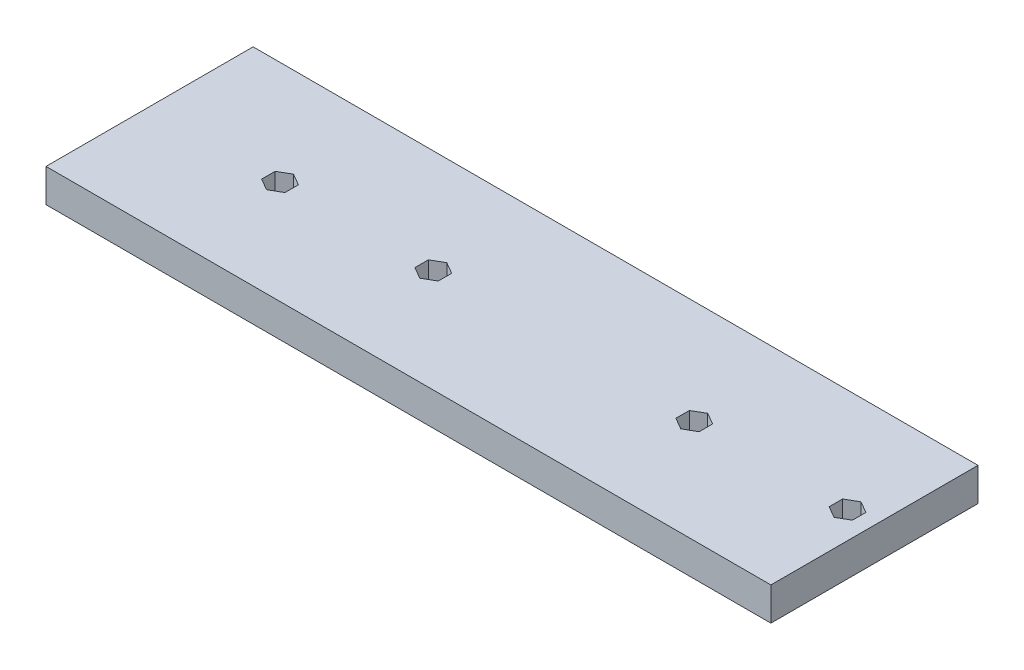
ISO-10303-21;
HEADER;
FILE_DESCRIPTION(('STEP AP214'),'2;1');
FILE_NAME('part.step','',(''),(''),'','','');
FILE_SCHEMA(('AUTOMOTIVE_DESIGN { 1 0 10303 214 1 1 1 1 }'));
ENDSEC;
DATA;
#1=APPLICATION_CONTEXT('core data for automotive mechanical design processes');
#2=APPLICATION_PROTOCOL_DEFINITION('international standard','automotive_design',2000,#1);
#3=PRODUCT_CONTEXT('',#1,'mechanical');
#4=PRODUCT('Part','Part','',(#3));
#5=PRODUCT_RELATED_PRODUCT_CATEGORY('part','',(#4));
#6=PRODUCT_DEFINITION_FORMATION('','',#4);
#7=PRODUCT_DEFINITION_CONTEXT('part definition',#1,'design');
#8=PRODUCT_DEFINITION('design','',#6,#7);
#9=PRODUCT_DEFINITION_SHAPE('','',#8);
#10=(LENGTH_UNIT() NAMED_UNIT(*) SI_UNIT(.MILLI.,.METRE.));
#11=(NAMED_UNIT(*) PLANE_ANGLE_UNIT() SI_UNIT($,.RADIAN.));
#12=(NAMED_UNIT(*) SI_UNIT($,.STERADIAN.) SOLID_ANGLE_UNIT());
#13=UNCERTAINTY_MEASURE_WITH_UNIT(LENGTH_MEASURE(1.E-05),#10,'distance_accuracy_value','');
#14=(GEOMETRIC_REPRESENTATION_CONTEXT(3) GLOBAL_UNCERTAINTY_ASSIGNED_CONTEXT((#13)) GLOBAL_UNIT_ASSIGNED_CONTEXT((#10,
#11,#12)) REPRESENTATION_CONTEXT('',''));
#15=CARTESIAN_POINT('',(0.,0.,0.));
#16=DIRECTION('',(0.,0.,1.));
#17=DIRECTION('',(1.,0.,0.));
#18=AXIS2_PLACEMENT_3D('',#15,#16,#17);
#19=CARTESIAN_POINT('',(975.,-0.00999999999999959,-50.));
#20=DIRECTION('',(-1.,0.,0.));
#21=DIRECTION('',(0.,0.,1.));
#22=AXIS2_PLACEMENT_3D('',#19,#20,#21);
#23=PLANE('',#22);
#24=DIRECTION('',(0.,0.,-1.));
#25=VECTOR('',#24,1.);
#26=CARTESIAN_POINT('',(975.,0.,0.));
#27=LINE('',#26,#25);
#28=CARTESIAN_POINT('',(975.,0.,0.));
#29=VERTEX_POINT('',#28);
#30=CARTESIAN_POINT('',(975.,0.,-50.));
#31=VERTEX_POINT('',#30);
#32=EDGE_CURVE('E213',#29,#31,#27,.T.);
#33=ORIENTED_EDGE('',*,*,#32,.F.);
#34=DIRECTION('',(0.,1.,0.));
#35=VECTOR('',#34,1.);
#36=CARTESIAN_POINT('',(975.,8.,0.));
#37=LINE('',#36,#35);
#38=CARTESIAN_POINT('',(975.,8.,0.));
#39=VERTEX_POINT('',#38);
#40=EDGE_CURVE('E217',#29,#39,#37,.T.);
#41=ORIENTED_EDGE('',*,*,#40,.T.);
#42=DIRECTION('',(0.,0.,-1.));
#43=VECTOR('',#42,1.);
#44=CARTESIAN_POINT('',(975.,8.,0.));
#45=LINE('',#44,#43);
#46=CARTESIAN_POINT('',(975.,8.,-50.));
#47=VERTEX_POINT('',#46);
#48=EDGE_CURVE('E223',#39,#47,#45,.T.);
#49=ORIENTED_EDGE('',*,*,#48,.T.);
#50=DIRECTION('',(0.,-1.,0.));
#51=VECTOR('',#50,1.);
#52=CARTESIAN_POINT('',(975.,8.,-50.));
#53=LINE('',#52,#51);
#54=EDGE_CURVE('E220',#47,#31,#53,.T.);
#55=ORIENTED_EDGE('',*,*,#54,.T.);
#56=EDGE_LOOP('',(#33,#41,#49,#55));
#57=FACE_BOUND('',#56,.T.);
#58=ADVANCED_FACE('F36',(#57),#23,.T.);
#59=CARTESIAN_POINT('',(0.,3.,0.));
#60=DIRECTION('',(0.,1.,0.));
#61=DIRECTION('',(0.,0.,1.));
#62=AXIS2_PLACEMENT_3D('',#59,#60,#61);
#63=PLANE('',#62);
#64=DIRECTION('',(0.866025403784436,0.,0.500000000000005));
#65=VECTOR('',#64,1.);
#66=CARTESIAN_POINT('',(1003.6854174377,3.,-23.375));
#67=LINE('',#66,#65);
#68=CARTESIAN_POINT('',(1003.6854174377,3.,-23.375));
#69=VERTEX_POINT('',#68);
#70=CARTESIAN_POINT('',(1006.5,3.,-21.75));
#71=VERTEX_POINT('',#70);
#72=EDGE_CURVE('E188',#69,#71,#67,.T.);
#73=ORIENTED_EDGE('',*,*,#72,.T.);
#74=DIRECTION('',(0.866025403784435,0.,-0.500000000000007));
#75=VECTOR('',#74,1.);
#76=CARTESIAN_POINT('',(1006.5,3.,-21.75));
#77=LINE('',#76,#75);
#78=CARTESIAN_POINT('',(1009.3145825623,3.,-23.375));
#79=VERTEX_POINT('',#78);
#80=EDGE_CURVE('E197',#71,#79,#77,.T.);
#81=ORIENTED_EDGE('',*,*,#80,.T.);
#82=DIRECTION('',(0.,0.,-1.));
#83=VECTOR('',#82,1.);
#84=CARTESIAN_POINT('',(1009.3145825623,3.,-23.375));
#85=LINE('',#84,#83);
#86=CARTESIAN_POINT('',(1009.3145825623,3.,-26.625));
#87=VERTEX_POINT('',#86);
#88=EDGE_CURVE('E201',#79,#87,#85,.T.);
#89=ORIENTED_EDGE('',*,*,#88,.T.);
#90=DIRECTION('',(-0.866025403784436,0.,-0.500000000000005));
#91=VECTOR('',#90,1.);
#92=CARTESIAN_POINT('',(1009.3145825623,3.,-26.625));
#93=LINE('',#92,#91);
#94=CARTESIAN_POINT('',(1006.5,3.,-28.25));
#95=VERTEX_POINT('',#94);
#96=EDGE_CURVE('E416',#87,#95,#93,.T.);
#97=ORIENTED_EDGE('',*,*,#96,.T.);
#98=DIRECTION('',(-0.866025403784435,0.,0.500000000000007));
#99=VECTOR('',#98,1.);
#100=CARTESIAN_POINT('',(1006.5,3.,-28.25));
#101=LINE('',#100,#99);
#102=CARTESIAN_POINT('',(1003.6854174377,3.,-26.625));
#103=VERTEX_POINT('',#102);
#104=EDGE_CURVE('E414',#95,#103,#101,.T.);
#105=ORIENTED_EDGE('',*,*,#104,.T.);
#106=DIRECTION('',(0.,0.,1.));
#107=VECTOR('',#106,1.);
#108=CARTESIAN_POINT('',(1003.6854174377,3.,-26.625));
#109=LINE('',#108,#107);
#110=EDGE_CURVE('E194',#103,#69,#109,.T.);
#111=ORIENTED_EDGE('',*,*,#110,.T.);
#112=EDGE_LOOP('',(#73,#81,#89,#97,#105,#111));
#113=FACE_BOUND('',#112,.T.);
#114=ADVANCED_FACE('F203',(#113),#63,.T.);
#115=CARTESIAN_POINT('',(0.,3.,0.));
#116=DIRECTION('',(0.,1.,0.));
#117=DIRECTION('',(0.,0.,1.));
#118=AXIS2_PLACEMENT_3D('',#115,#116,#117);
#119=PLANE('',#118);
#120=DIRECTION('',(-0.866025403784433,0.,-0.50000000000001));
#121=VECTOR('',#120,1.);
#122=CARTESIAN_POINT('',(1046.3145825623,3.,-26.625));
#123=LINE('',#122,#121);
#124=CARTESIAN_POINT('',(1046.3145825623,3.,-26.625));
#125=VERTEX_POINT('',#124);
#126=CARTESIAN_POINT('',(1043.5,3.,-28.25));
#127=VERTEX_POINT('',#126);
#128=EDGE_CURVE('E364',#125,#127,#123,.T.);
#129=ORIENTED_EDGE('',*,*,#128,.T.);
#130=DIRECTION('',(-0.866025403784453,0.,0.499999999999976));
#131=VECTOR('',#130,1.);
#132=CARTESIAN_POINT('',(1043.5,3.,-28.25));
#133=LINE('',#132,#131);
#134=CARTESIAN_POINT('',(1040.6854174377,3.,-26.625));
#135=VERTEX_POINT('',#134);
#136=EDGE_CURVE('E389',#127,#135,#133,.T.);
#137=ORIENTED_EDGE('',*,*,#136,.T.);
#138=DIRECTION('',(0.,0.,1.));
#139=VECTOR('',#138,1.);
#140=CARTESIAN_POINT('',(1040.6854174377,3.,-26.625));
#141=LINE('',#140,#139);
#142=CARTESIAN_POINT('',(1040.6854174377,3.,-23.375));
#143=VERTEX_POINT('',#142);
#144=EDGE_CURVE('E386',#135,#143,#141,.T.);
#145=ORIENTED_EDGE('',*,*,#144,.T.);
#146=DIRECTION('',(0.866025403784452,0.,0.499999999999976));
#147=VECTOR('',#146,1.);
#148=CARTESIAN_POINT('',(1040.6854174377,3.,-23.375));
#149=LINE('',#148,#147);
#150=CARTESIAN_POINT('',(1043.5,3.,-21.75));
#151=VERTEX_POINT('',#150);
#152=EDGE_CURVE('E383',#143,#151,#149,.T.);
#153=ORIENTED_EDGE('',*,*,#152,.T.);
#154=DIRECTION('',(0.866025403784437,0.,-0.500000000000003));
#155=VECTOR('',#154,1.);
#156=CARTESIAN_POINT('',(1043.5,3.,-21.75));
#157=LINE('',#156,#155);
#158=CARTESIAN_POINT('',(1046.3145825623,3.,-23.375));
#159=VERTEX_POINT('',#158);
#160=EDGE_CURVE('E380',#151,#159,#157,.T.);
#161=ORIENTED_EDGE('',*,*,#160,.T.);
#162=DIRECTION('',(0.,0.,-1.));
#163=VECTOR('',#162,1.);
#164=CARTESIAN_POINT('',(1046.3145825623,3.,-23.375));
#165=LINE('',#164,#163);
#166=EDGE_CURVE('E349',#159,#125,#165,.T.);
#167=ORIENTED_EDGE('',*,*,#166,.T.);
#168=EDGE_LOOP('',(#129,#137,#145,#153,#161,#167));
#169=FACE_BOUND('',#168,.T.);
#170=ADVANCED_FACE('F490',(#169),#119,.T.);
#171=CARTESIAN_POINT('',(0.,3.,0.));
#172=DIRECTION('',(0.,1.,0.));
#173=DIRECTION('',(0.,0.,1.));
#174=AXIS2_PLACEMENT_3D('',#171,#172,#173);
#175=PLANE('',#174);
#176=DIRECTION('',(0.866025403784436,0.,0.500000000000005));
#177=VECTOR('',#176,1.);
#178=CARTESIAN_POINT('',(1103.6854174377,3.,-23.375));
#179=LINE('',#178,#177);
#180=CARTESIAN_POINT('',(1103.6854174377,3.,-23.375));
#181=VERTEX_POINT('',#180);
#182=CARTESIAN_POINT('',(1106.5,3.,-21.75));
#183=VERTEX_POINT('',#182);
#184=EDGE_CURVE('E316',#181,#183,#179,.T.);
#185=ORIENTED_EDGE('',*,*,#184,.T.);
#186=DIRECTION('',(0.866025403784435,0.,-0.500000000000007));
#187=VECTOR('',#186,1.);
#188=CARTESIAN_POINT('',(1106.5,3.,-21.75));
#189=LINE('',#188,#187);
#190=CARTESIAN_POINT('',(1109.3145825623,3.,-23.375));
#191=VERTEX_POINT('',#190);
#192=EDGE_CURVE('E341',#183,#191,#189,.T.);
#193=ORIENTED_EDGE('',*,*,#192,.T.);
#194=DIRECTION('',(0.,0.,-1.));
#195=VECTOR('',#194,1.);
#196=CARTESIAN_POINT('',(1109.3145825623,3.,-23.375));
#197=LINE('',#196,#195);
#198=CARTESIAN_POINT('',(1109.3145825623,3.,-26.625));
#199=VERTEX_POINT('',#198);
#200=EDGE_CURVE('E338',#191,#199,#197,.T.);
#201=ORIENTED_EDGE('',*,*,#200,.T.);
#202=DIRECTION('',(-0.866025403784436,0.,-0.500000000000005));
#203=VECTOR('',#202,1.);
#204=CARTESIAN_POINT('',(1109.3145825623,3.,-26.625));
#205=LINE('',#204,#203);
#206=CARTESIAN_POINT('',(1106.5,3.,-28.25));
#207=VERTEX_POINT('',#206);
#208=EDGE_CURVE('E335',#199,#207,#205,.T.);
#209=ORIENTED_EDGE('',*,*,#208,.T.);
#210=DIRECTION('',(-0.866025403784435,0.,0.500000000000007));
#211=VECTOR('',#210,1.);
#212=CARTESIAN_POINT('',(1106.5,3.,-28.25));
#213=LINE('',#212,#211);
#214=CARTESIAN_POINT('',(1103.6854174377,3.,-26.625));
#215=VERTEX_POINT('',#214);
#216=EDGE_CURVE('E332',#207,#215,#213,.T.);
#217=ORIENTED_EDGE('',*,*,#216,.T.);
#218=DIRECTION('',(0.,0.,1.));
#219=VECTOR('',#218,1.);
#220=CARTESIAN_POINT('',(1103.6854174377,3.,-26.625));
#221=LINE('',#220,#219);
#222=EDGE_CURVE('E300',#215,#181,#221,.T.);
#223=ORIENTED_EDGE('',*,*,#222,.T.);
#224=EDGE_LOOP('',(#185,#193,#201,#209,#217,#223));
#225=FACE_BOUND('',#224,.T.);
#226=ADVANCED_FACE('F496',(#225),#175,.T.);
#227=CARTESIAN_POINT('',(0.,3.,0.));
#228=DIRECTION('',(0.,1.,0.));
#229=DIRECTION('',(0.,0.,1.));
#230=AXIS2_PLACEMENT_3D('',#227,#228,#229);
#231=PLANE('',#230);
#232=DIRECTION('',(-0.866025403784433,0.,-0.50000000000001));
#233=VECTOR('',#232,1.);
#234=CARTESIAN_POINT('',(1146.3145825623,3.,-26.625));
#235=LINE('',#234,#233);
#236=CARTESIAN_POINT('',(1146.3145825623,3.,-26.625));
#237=VERTEX_POINT('',#236);
#238=CARTESIAN_POINT('',(1143.5,3.,-28.25));
#239=VERTEX_POINT('',#238);
#240=EDGE_CURVE('E272',#237,#239,#235,.T.);
#241=ORIENTED_EDGE('',*,*,#240,.T.);
#242=DIRECTION('',(-0.866025403784453,0.,0.499999999999976));
#243=VECTOR('',#242,1.);
#244=CARTESIAN_POINT('',(1143.5,3.,-28.25));
#245=LINE('',#244,#243);
#246=CARTESIAN_POINT('',(1140.6854174377,3.,-26.625));
#247=VERTEX_POINT('',#246);
#248=EDGE_CURVE('E292',#239,#247,#245,.T.);
#249=ORIENTED_EDGE('',*,*,#248,.T.);
#250=DIRECTION('',(0.,0.,1.));
#251=VECTOR('',#250,1.);
#252=CARTESIAN_POINT('',(1140.6854174377,3.,-26.625));
#253=LINE('',#252,#251);
#254=CARTESIAN_POINT('',(1140.6854174377,3.,-23.375));
#255=VERTEX_POINT('',#254);
#256=EDGE_CURVE('E289',#247,#255,#253,.T.);
#257=ORIENTED_EDGE('',*,*,#256,.T.);
#258=DIRECTION('',(0.866025403784452,0.,0.499999999999976));
#259=VECTOR('',#258,1.);
#260=CARTESIAN_POINT('',(1140.6854174377,3.,-23.375));
#261=LINE('',#260,#259);
#262=CARTESIAN_POINT('',(1143.5,3.,-21.75));
#263=VERTEX_POINT('',#262);
#264=EDGE_CURVE('E286',#255,#263,#261,.T.);
#265=ORIENTED_EDGE('',*,*,#264,.T.);
#266=DIRECTION('',(0.866025403784437,0.,-0.500000000000003));
#267=VECTOR('',#266,1.);
#268=CARTESIAN_POINT('',(1143.5,3.,-21.75));
#269=LINE('',#268,#267);
#270=CARTESIAN_POINT('',(1146.3145825623,3.,-23.375));
#271=VERTEX_POINT('',#270);
#272=EDGE_CURVE('E283',#263,#271,#269,.T.);
#273=ORIENTED_EDGE('',*,*,#272,.T.);
#274=DIRECTION('',(0.,0.,-1.));
#275=VECTOR('',#274,1.);
#276=CARTESIAN_POINT('',(1146.3145825623,3.,-23.375));
#277=LINE('',#276,#275);
#278=EDGE_CURVE('E254',#271,#237,#277,.T.);
#279=ORIENTED_EDGE('',*,*,#278,.T.);
#280=EDGE_LOOP('',(#241,#249,#257,#265,#273,#279));
#281=FACE_BOUND('',#280,.T.);
#282=ADVANCED_FACE('F473',(#281),#231,.T.);
#283=CARTESIAN_POINT('',(1150.,8.,0.));
#284=DIRECTION('',(-1.,0.,0.));
#285=DIRECTION('',(0.,0.,1.));
#286=AXIS2_PLACEMENT_3D('',#283,#284,#285);
#287=PLANE('',#286);
#288=DIRECTION('',(0.,0.,-1.));
#289=VECTOR('',#288,1.);
#290=CARTESIAN_POINT('',(1150.,0.,0.));
#291=LINE('',#290,#289);
#292=CARTESIAN_POINT('',(1150.,0.,0.));
#293=VERTEX_POINT('',#292);
#294=CARTESIAN_POINT('',(1150.,0.,-50.));
#295=VERTEX_POINT('',#294);
#296=EDGE_CURVE('E230',#293,#295,#291,.T.);
#297=ORIENTED_EDGE('',*,*,#296,.T.);
#298=DIRECTION('',(0.,-1.,0.));
#299=VECTOR('',#298,1.);
#300=CARTESIAN_POINT('',(1150.,8.,-50.));
#301=LINE('',#300,#299);
#302=CARTESIAN_POINT('',(1150.,8.,-50.));
#303=VERTEX_POINT('',#302);
#304=EDGE_CURVE('E247',#303,#295,#301,.T.);
#305=ORIENTED_EDGE('',*,*,#304,.F.);
#306=DIRECTION('',(0.,0.,-1.));
#307=VECTOR('',#306,1.);
#308=CARTESIAN_POINT('',(1150.,8.,0.));
#309=LINE('',#308,#307);
#310=CARTESIAN_POINT('',(1150.,8.,0.));
#311=VERTEX_POINT('',#310);
#312=EDGE_CURVE('E235',#311,#303,#309,.T.);
#313=ORIENTED_EDGE('',*,*,#312,.F.);
#314=DIRECTION('',(0.,-1.,0.));
#315=VECTOR('',#314,1.);
#316=CARTESIAN_POINT('',(1150.,8.,0.));
#317=LINE('',#316,#315);
#318=EDGE_CURVE('E216',#311,#293,#317,.T.);
#319=ORIENTED_EDGE('',*,*,#318,.T.);
#320=EDGE_LOOP('',(#297,#305,#313,#319));
#321=FACE_BOUND('',#320,.T.);
#322=ADVANCED_FACE('F511',(#321),#287,.F.);
#323=CARTESIAN_POINT('',(0.,8.,-50.));
#324=DIRECTION('',(0.,0.,1.));
#325=DIRECTION('',(1.,0.,0.));
#326=AXIS2_PLACEMENT_3D('',#323,#324,#325);
#327=PLANE('',#326);
#328=ORIENTED_EDGE('',*,*,#54,.F.);
#329=DIRECTION('',(-1.,0.,0.));
#330=VECTOR('',#329,1.);
#331=CARTESIAN_POINT('',(0.,8.,-50.));
#332=LINE('',#331,#330);
#333=EDGE_CURVE('E40',#303,#47,#332,.T.);
#334=ORIENTED_EDGE('',*,*,#333,.F.);
#335=ORIENTED_EDGE('',*,*,#304,.T.);
#336=DIRECTION('',(-1.,0.,0.));
#337=VECTOR('',#336,1.);
#338=CARTESIAN_POINT('',(0.,0.,-50.));
#339=LINE('',#338,#337);
#340=EDGE_CURVE('E231',#295,#31,#339,.T.);
#341=ORIENTED_EDGE('',*,*,#340,.T.);
#342=EDGE_LOOP('',(#328,#334,#335,#341));
#343=FACE_BOUND('',#342,.T.);
#344=ADVANCED_FACE('F508',(#343),#327,.F.);
#345=CARTESIAN_POINT('',(0.,8.,0.));
#346=DIRECTION('',(0.,0.,-1.));
#347=DIRECTION('',(-1.,0.,0.));
#348=AXIS2_PLACEMENT_3D('',#345,#346,#347);
#349=PLANE('',#348);
#350=ORIENTED_EDGE('',*,*,#40,.F.);
#351=DIRECTION('',(1.,0.,0.));
#352=VECTOR('',#351,1.);
#353=CARTESIAN_POINT('',(0.,0.,0.));
#354=LINE('',#353,#352);
#355=EDGE_CURVE('E226',#29,#293,#354,.T.);
#356=ORIENTED_EDGE('',*,*,#355,.T.);
#357=ORIENTED_EDGE('',*,*,#318,.F.);
#358=DIRECTION('',(1.,0.,0.));
#359=VECTOR('',#358,1.);
#360=CARTESIAN_POINT('',(0.,8.,0.));
#361=LINE('',#360,#359);
#362=EDGE_CURVE('E233',#39,#311,#361,.T.);
#363=ORIENTED_EDGE('',*,*,#362,.F.);
#364=EDGE_LOOP('',(#350,#356,#357,#363));
#365=FACE_BOUND('',#364,.T.);
#366=ADVANCED_FACE('F505',(#365),#349,.F.);
#367=CARTESIAN_POINT('',(0.,0.,0.));
#368=DIRECTION('',(0.,-1.,0.));
#369=DIRECTION('',(0.,0.,-1.));
#370=AXIS2_PLACEMENT_3D('',#367,#368,#369);
#371=PLANE('',#370);
#372=ORIENTED_EDGE('',*,*,#355,.F.);
#373=ORIENTED_EDGE('',*,*,#32,.T.);
#374=ORIENTED_EDGE('',*,*,#340,.F.);
#375=ORIENTED_EDGE('',*,*,#296,.F.);
#376=EDGE_LOOP('',(#372,#373,#374,#375));
#377=FACE_BOUND('',#376,.T.);
#378=ADVANCED_FACE('F38',(#377),#371,.T.);
#379=CARTESIAN_POINT('',(1009.3145825623,3.,-23.375));
#380=DIRECTION('',(1.,0.,0.));
#381=DIRECTION('',(0.,0.,-1.));
#382=AXIS2_PLACEMENT_3D('',#379,#380,#381);
#383=PLANE('',#382);
#384=DIRECTION('',(0.,0.,-1.));
#385=VECTOR('',#384,1.);
#386=CARTESIAN_POINT('',(1009.3145825623,8.,-23.375));
#387=LINE('',#386,#385);
#388=CARTESIAN_POINT('',(1009.3145825623,8.,-23.375));
#389=VERTEX_POINT('',#388);
#390=CARTESIAN_POINT('',(1009.3145825623,8.,-26.625));
#391=VERTEX_POINT('',#390);
#392=EDGE_CURVE('E407',#389,#391,#387,.T.);
#393=ORIENTED_EDGE('',*,*,#392,.T.);
#394=DIRECTION('',(0.,1.,0.));
#395=VECTOR('',#394,1.);
#396=CARTESIAN_POINT('',(1009.3145825623,3.,-26.625));
#397=LINE('',#396,#395);
#398=EDGE_CURVE('E395',#87,#391,#397,.T.);
#399=ORIENTED_EDGE('',*,*,#398,.F.);
#400=ORIENTED_EDGE('',*,*,#88,.F.);
#401=DIRECTION('',(0.,1.,0.));
#402=VECTOR('',#401,1.);
#403=CARTESIAN_POINT('',(1009.3145825623,3.,-23.375));
#404=LINE('',#403,#402);
#405=EDGE_CURVE('E178',#79,#389,#404,.T.);
#406=ORIENTED_EDGE('',*,*,#405,.T.);
#407=EDGE_LOOP('',(#393,#399,#400,#406));
#408=FACE_BOUND('',#407,.T.);
#409=ADVANCED_FACE('F420',(#408),#383,.F.);
#410=CARTESIAN_POINT('',(1009.3145825623,3.,-26.625));
#411=DIRECTION('',(0.500000000000005,0.,-0.866025403784436));
#412=DIRECTION('',(-0.866025403784436,0.,-0.500000000000005));
#413=AXIS2_PLACEMENT_3D('',#410,#411,#412);
#414=PLANE('',#413);
#415=DIRECTION('',(-0.866025403784436,0.,-0.500000000000005));
#416=VECTOR('',#415,1.);
#417=CARTESIAN_POINT('',(1009.3145825623,8.,-26.625));
#418=LINE('',#417,#416);
#419=CARTESIAN_POINT('',(1006.5,8.,-28.25));
#420=VERTEX_POINT('',#419);
#421=EDGE_CURVE('E404',#391,#420,#418,.T.);
#422=ORIENTED_EDGE('',*,*,#421,.T.);
#423=DIRECTION('',(0.,1.,0.));
#424=VECTOR('',#423,1.);
#425=CARTESIAN_POINT('',(1006.5,3.,-28.25));
#426=LINE('',#425,#424);
#427=EDGE_CURVE('E397',#95,#420,#426,.T.);
#428=ORIENTED_EDGE('',*,*,#427,.F.);
#429=ORIENTED_EDGE('',*,*,#96,.F.);
#430=ORIENTED_EDGE('',*,*,#398,.T.);
#431=EDGE_LOOP('',(#422,#428,#429,#430));
#432=FACE_BOUND('',#431,.T.);
#433=ADVANCED_FACE('F424',(#432),#414,.F.);
#434=CARTESIAN_POINT('',(1006.5,3.,-28.25));
#435=DIRECTION('',(-0.500000000000007,0.,-0.866025403784435));
#436=DIRECTION('',(-0.866025403784435,0.,0.500000000000007));
#437=AXIS2_PLACEMENT_3D('',#434,#435,#436);
#438=PLANE('',#437);
#439=DIRECTION('',(-0.866025403784435,0.,0.500000000000007));
#440=VECTOR('',#439,1.);
#441=CARTESIAN_POINT('',(1006.5,8.,-28.25));
#442=LINE('',#441,#440);
#443=CARTESIAN_POINT('',(1003.6854174377,8.,-26.625));
#444=VERTEX_POINT('',#443);
#445=EDGE_CURVE('E209',#420,#444,#442,.T.);
#446=ORIENTED_EDGE('',*,*,#445,.T.);
#447=DIRECTION('',(0.,1.,0.));
#448=VECTOR('',#447,1.);
#449=CARTESIAN_POINT('',(1003.6854174377,3.,-26.625));
#450=LINE('',#449,#448);
#451=EDGE_CURVE('E399',#103,#444,#450,.T.);
#452=ORIENTED_EDGE('',*,*,#451,.F.);
#453=ORIENTED_EDGE('',*,*,#104,.F.);
#454=ORIENTED_EDGE('',*,*,#427,.T.);
#455=EDGE_LOOP('',(#446,#452,#453,#454));
#456=FACE_BOUND('',#455,.T.);
#457=ADVANCED_FACE('F428',(#456),#438,.F.);
#458=CARTESIAN_POINT('',(1003.6854174377,3.,-26.625));
#459=DIRECTION('',(-1.,0.,0.));
#460=DIRECTION('',(0.,0.,1.));
#461=AXIS2_PLACEMENT_3D('',#458,#459,#460);
#462=PLANE('',#461);
#463=DIRECTION('',(0.,0.,1.));
#464=VECTOR('',#463,1.);
#465=CARTESIAN_POINT('',(1003.6854174377,8.,-26.625));
#466=LINE('',#465,#464);
#467=CARTESIAN_POINT('',(1003.6854174377,8.,-23.375));
#468=VERTEX_POINT('',#467);
#469=EDGE_CURVE('E206',#444,#468,#466,.T.);
#470=ORIENTED_EDGE('',*,*,#469,.T.);
#471=DIRECTION('',(0.,1.,0.));
#472=VECTOR('',#471,1.);
#473=CARTESIAN_POINT('',(1003.6854174377,3.,-23.375));
#474=LINE('',#473,#472);
#475=EDGE_CURVE('E229',#69,#468,#474,.T.);
#476=ORIENTED_EDGE('',*,*,#475,.F.);
#477=ORIENTED_EDGE('',*,*,#110,.F.);
#478=ORIENTED_EDGE('',*,*,#451,.T.);
#479=EDGE_LOOP('',(#470,#476,#477,#478));
#480=FACE_BOUND('',#479,.T.);
#481=ADVANCED_FACE('F430',(#480),#462,.F.);
#482=CARTESIAN_POINT('',(1003.6854174377,3.,-23.375));
#483=DIRECTION('',(-0.500000000000005,0.,0.866025403784436));
#484=DIRECTION('',(0.866025403784436,0.,0.500000000000005));
#485=AXIS2_PLACEMENT_3D('',#482,#483,#484);
#486=PLANE('',#485);
#487=DIRECTION('',(0.866025403784436,0.,0.500000000000005));
#488=VECTOR('',#487,1.);
#489=CARTESIAN_POINT('',(1003.6854174377,8.,-23.375));
#490=LINE('',#489,#488);
#491=CARTESIAN_POINT('',(1006.5,8.,-21.75));
#492=VERTEX_POINT('',#491);
#493=EDGE_CURVE('E192',#468,#492,#490,.T.);
#494=ORIENTED_EDGE('',*,*,#493,.T.);
#495=DIRECTION('',(0.,1.,0.));
#496=VECTOR('',#495,1.);
#497=CARTESIAN_POINT('',(1006.5,3.,-21.75));
#498=LINE('',#497,#496);
#499=EDGE_CURVE('E185',#71,#492,#498,.T.);
#500=ORIENTED_EDGE('',*,*,#499,.F.);
#501=ORIENTED_EDGE('',*,*,#72,.F.);
#502=ORIENTED_EDGE('',*,*,#475,.T.);
#503=EDGE_LOOP('',(#494,#500,#501,#502));
#504=FACE_BOUND('',#503,.T.);
#505=ADVANCED_FACE('F186',(#504),#486,.F.);
#506=CARTESIAN_POINT('',(1006.5,3.,-21.75));
#507=DIRECTION('',(0.500000000000007,0.,0.866025403784435));
#508=DIRECTION('',(0.866025403784435,0.,-0.500000000000007));
#509=AXIS2_PLACEMENT_3D('',#506,#507,#508);
#510=PLANE('',#509);
#511=DIRECTION('',(0.866025403784435,0.,-0.500000000000007));
#512=VECTOR('',#511,1.);
#513=CARTESIAN_POINT('',(1006.5,8.,-21.75));
#514=LINE('',#513,#512);
#515=EDGE_CURVE('E410',#492,#389,#514,.T.);
#516=ORIENTED_EDGE('',*,*,#515,.T.);
#517=ORIENTED_EDGE('',*,*,#405,.F.);
#518=ORIENTED_EDGE('',*,*,#80,.F.);
#519=ORIENTED_EDGE('',*,*,#499,.T.);
#520=EDGE_LOOP('',(#516,#517,#518,#519));
#521=FACE_BOUND('',#520,.T.);
#522=ADVANCED_FACE('F198',(#521),#510,.F.);
#523=CARTESIAN_POINT('',(1040.6854174377,3.,-26.625));
#524=DIRECTION('',(-1.,0.,0.));
#525=DIRECTION('',(0.,0.,1.));
#526=AXIS2_PLACEMENT_3D('',#523,#524,#525);
#527=PLANE('',#526);
#528=DIRECTION('',(0.,0.,1.));
#529=VECTOR('',#528,1.);
#530=CARTESIAN_POINT('',(1040.6854174377,8.,-26.625));
#531=LINE('',#530,#529);
#532=CARTESIAN_POINT('',(1040.6854174377,8.,-26.625));
#533=VERTEX_POINT('',#532);
#534=CARTESIAN_POINT('',(1040.6854174377,8.,-23.375));
#535=VERTEX_POINT('',#534);
#536=EDGE_CURVE('E370',#533,#535,#531,.T.);
#537=ORIENTED_EDGE('',*,*,#536,.T.);
#538=DIRECTION('',(0.,1.,0.));
#539=VECTOR('',#538,1.);
#540=CARTESIAN_POINT('',(1040.6854174377,3.,-23.375));
#541=LINE('',#540,#539);
#542=EDGE_CURVE('E352',#143,#535,#541,.T.);
#543=ORIENTED_EDGE('',*,*,#542,.F.);
#544=ORIENTED_EDGE('',*,*,#144,.F.);
#545=DIRECTION('',(0.,1.,0.));
#546=VECTOR('',#545,1.);
#547=CARTESIAN_POINT('',(1040.6854174377,3.,-26.625));
#548=LINE('',#547,#546);
#549=EDGE_CURVE('E350',#135,#533,#548,.T.);
#550=ORIENTED_EDGE('',*,*,#549,.T.);
#551=EDGE_LOOP('',(#537,#543,#544,#550));
#552=FACE_BOUND('',#551,.T.);
#553=ADVANCED_FACE('F666',(#552),#527,.F.);
#554=CARTESIAN_POINT('',(1040.6854174377,3.,-23.375));
#555=DIRECTION('',(-0.499999999999976,0.,0.866025403784452));
#556=DIRECTION('',(0.866025403784452,0.,0.499999999999976));
#557=AXIS2_PLACEMENT_3D('',#554,#555,#556);
#558=PLANE('',#557);
#559=DIRECTION('',(0.866025403784452,0.,0.499999999999976));
#560=VECTOR('',#559,1.);
#561=CARTESIAN_POINT('',(1040.6854174377,8.,-23.375));
#562=LINE('',#561,#560);
#563=CARTESIAN_POINT('',(1043.5,8.,-21.75));
#564=VERTEX_POINT('',#563);
#565=EDGE_CURVE('E367',#535,#564,#562,.T.);
#566=ORIENTED_EDGE('',*,*,#565,.T.);
#567=DIRECTION('',(0.,1.,0.));
#568=VECTOR('',#567,1.);
#569=CARTESIAN_POINT('',(1043.5,3.,-21.75));
#570=LINE('',#569,#568);
#571=EDGE_CURVE('E354',#151,#564,#570,.T.);
#572=ORIENTED_EDGE('',*,*,#571,.F.);
#573=ORIENTED_EDGE('',*,*,#152,.F.);
#574=ORIENTED_EDGE('',*,*,#542,.T.);
#575=EDGE_LOOP('',(#566,#572,#573,#574));
#576=FACE_BOUND('',#575,.T.);
#577=ADVANCED_FACE('F656',(#576),#558,.F.);
#578=CARTESIAN_POINT('',(1043.5,3.,-21.75));
#579=DIRECTION('',(0.500000000000003,0.,0.866025403784437));
#580=DIRECTION('',(0.866025403784437,0.,-0.500000000000003));
#581=AXIS2_PLACEMENT_3D('',#578,#579,#580);
#582=PLANE('',#581);
#583=DIRECTION('',(0.866025403784437,0.,-0.500000000000003));
#584=VECTOR('',#583,1.);
#585=CARTESIAN_POINT('',(1043.5,8.,-21.75));
#586=LINE('',#585,#584);
#587=CARTESIAN_POINT('',(1046.3145825623,8.,-23.375));
#588=VERTEX_POINT('',#587);
#589=EDGE_CURVE('E363',#564,#588,#586,.T.);
#590=ORIENTED_EDGE('',*,*,#589,.T.);
#591=DIRECTION('',(0.,1.,0.));
#592=VECTOR('',#591,1.);
#593=CARTESIAN_POINT('',(1046.3145825623,3.,-23.375));
#594=LINE('',#593,#592);
#595=EDGE_CURVE('E356',#159,#588,#594,.T.);
#596=ORIENTED_EDGE('',*,*,#595,.F.);
#597=ORIENTED_EDGE('',*,*,#160,.F.);
#598=ORIENTED_EDGE('',*,*,#571,.T.);
#599=EDGE_LOOP('',(#590,#596,#597,#598));
#600=FACE_BOUND('',#599,.T.);
#601=ADVANCED_FACE('F646',(#600),#582,.F.);
#602=CARTESIAN_POINT('',(1046.3145825623,3.,-23.375));
#603=DIRECTION('',(1.,0.,0.));
#604=DIRECTION('',(0.,0.,-1.));
#605=AXIS2_PLACEMENT_3D('',#602,#603,#604);
#606=PLANE('',#605);
#607=DIRECTION('',(0.,0.,-1.));
#608=VECTOR('',#607,1.);
#609=CARTESIAN_POINT('',(1046.3145825623,8.,-23.375));
#610=LINE('',#609,#608);
#611=CARTESIAN_POINT('',(1046.3145825623,8.,-26.625));
#612=VERTEX_POINT('',#611);
#613=EDGE_CURVE('E360',#588,#612,#610,.T.);
#614=ORIENTED_EDGE('',*,*,#613,.T.);
#615=DIRECTION('',(0.,1.,0.));
#616=VECTOR('',#615,1.);
#617=CARTESIAN_POINT('',(1046.3145825623,3.,-26.625));
#618=LINE('',#617,#616);
#619=EDGE_CURVE('E358',#125,#612,#618,.T.);
#620=ORIENTED_EDGE('',*,*,#619,.F.);
#621=ORIENTED_EDGE('',*,*,#166,.F.);
#622=ORIENTED_EDGE('',*,*,#595,.T.);
#623=EDGE_LOOP('',(#614,#620,#621,#622));
#624=FACE_BOUND('',#623,.T.);
#625=ADVANCED_FACE('F636',(#624),#606,.F.);
#626=CARTESIAN_POINT('',(1046.3145825623,3.,-26.625));
#627=DIRECTION('',(0.50000000000001,0.,-0.866025403784433));
#628=DIRECTION('',(-0.866025403784433,0.,-0.50000000000001));
#629=AXIS2_PLACEMENT_3D('',#626,#627,#628);
#630=PLANE('',#629);
#631=DIRECTION('',(-0.866025403784433,0.,-0.50000000000001));
#632=VECTOR('',#631,1.);
#633=CARTESIAN_POINT('',(1046.3145825623,8.,-26.625));
#634=LINE('',#633,#632);
#635=CARTESIAN_POINT('',(1043.5,8.,-28.2500000000001));
#636=VERTEX_POINT('',#635);
#637=EDGE_CURVE('E311',#612,#636,#634,.T.);
#638=ORIENTED_EDGE('',*,*,#637,.T.);
#639=DIRECTION('',(0.,1.,0.));
#640=VECTOR('',#639,1.);
#641=CARTESIAN_POINT('',(1043.5,3.,-28.25));
#642=LINE('',#641,#640);
#643=EDGE_CURVE('E346',#127,#636,#642,.T.);
#644=ORIENTED_EDGE('',*,*,#643,.F.);
#645=ORIENTED_EDGE('',*,*,#128,.F.);
#646=ORIENTED_EDGE('',*,*,#619,.T.);
#647=EDGE_LOOP('',(#638,#644,#645,#646));
#648=FACE_BOUND('',#647,.T.);
#649=ADVANCED_FACE('F626',(#648),#630,.F.);
#650=CARTESIAN_POINT('',(1043.5,3.,-28.25));
#651=DIRECTION('',(-0.499999999999976,0.,-0.866025403784453));
#652=DIRECTION('',(-0.866025403784453,0.,0.499999999999976));
#653=AXIS2_PLACEMENT_3D('',#650,#651,#652);
#654=PLANE('',#653);
#655=DIRECTION('',(-0.866025403784453,0.,0.499999999999976));
#656=VECTOR('',#655,1.);
#657=CARTESIAN_POINT('',(1043.5,8.,-28.25));
#658=LINE('',#657,#656);
#659=EDGE_CURVE('E373',#636,#533,#658,.T.);
#660=ORIENTED_EDGE('',*,*,#659,.T.);
#661=ORIENTED_EDGE('',*,*,#549,.F.);
#662=ORIENTED_EDGE('',*,*,#136,.F.);
#663=ORIENTED_EDGE('',*,*,#643,.T.);
#664=EDGE_LOOP('',(#660,#661,#662,#663));
#665=FACE_BOUND('',#664,.T.);
#666=ADVANCED_FACE('F616',(#665),#654,.F.);
#667=CARTESIAN_POINT('',(1109.3145825623,3.,-23.375));
#668=DIRECTION('',(1.,0.,0.));
#669=DIRECTION('',(0.,0.,-1.));
#670=AXIS2_PLACEMENT_3D('',#667,#668,#669);
#671=PLANE('',#670);
#672=DIRECTION('',(0.,0.,-1.));
#673=VECTOR('',#672,1.);
#674=CARTESIAN_POINT('',(1109.3145825623,8.,-23.375));
#675=LINE('',#674,#673);
#676=CARTESIAN_POINT('',(1109.3145825623,8.,-23.375));
#677=VERTEX_POINT('',#676);
#678=CARTESIAN_POINT('',(1109.3145825623,8.,-26.625));
#679=VERTEX_POINT('',#678);
#680=EDGE_CURVE('E322',#677,#679,#675,.T.);
#681=ORIENTED_EDGE('',*,*,#680,.T.);
#682=DIRECTION('',(0.,1.,0.));
#683=VECTOR('',#682,1.);
#684=CARTESIAN_POINT('',(1109.3145825623,3.,-26.625));
#685=LINE('',#684,#683);
#686=EDGE_CURVE('E303',#199,#679,#685,.T.);
#687=ORIENTED_EDGE('',*,*,#686,.F.);
#688=ORIENTED_EDGE('',*,*,#200,.F.);
#689=DIRECTION('',(0.,1.,0.));
#690=VECTOR('',#689,1.);
#691=CARTESIAN_POINT('',(1109.3145825623,3.,-23.375));
#692=LINE('',#691,#690);
#693=EDGE_CURVE('E301',#191,#677,#692,.T.);
#694=ORIENTED_EDGE('',*,*,#693,.T.);
#695=EDGE_LOOP('',(#681,#687,#688,#694));
#696=FACE_BOUND('',#695,.T.);
#697=ADVANCED_FACE('F606',(#696),#671,.F.);
#698=CARTESIAN_POINT('',(1109.3145825623,3.,-26.625));
#699=DIRECTION('',(0.500000000000005,0.,-0.866025403784436));
#700=DIRECTION('',(-0.866025403784436,0.,-0.500000000000005));
#701=AXIS2_PLACEMENT_3D('',#698,#699,#700);
#702=PLANE('',#701);
#703=DIRECTION('',(-0.866025403784436,0.,-0.500000000000005));
#704=VECTOR('',#703,1.);
#705=CARTESIAN_POINT('',(1109.3145825623,8.,-26.625));
#706=LINE('',#705,#704);
#707=CARTESIAN_POINT('',(1106.5,8.,-28.25));
#708=VERTEX_POINT('',#707);
#709=EDGE_CURVE('E319',#679,#708,#706,.T.);
#710=ORIENTED_EDGE('',*,*,#709,.T.);
#711=DIRECTION('',(0.,1.,0.));
#712=VECTOR('',#711,1.);
#713=CARTESIAN_POINT('',(1106.5,3.,-28.25));
#714=LINE('',#713,#712);
#715=EDGE_CURVE('E305',#207,#708,#714,.T.);
#716=ORIENTED_EDGE('',*,*,#715,.F.);
#717=ORIENTED_EDGE('',*,*,#208,.F.);
#718=ORIENTED_EDGE('',*,*,#686,.T.);
#719=EDGE_LOOP('',(#710,#716,#717,#718));
#720=FACE_BOUND('',#719,.T.);
#721=ADVANCED_FACE('F596',(#720),#702,.F.);
#722=CARTESIAN_POINT('',(1106.5,3.,-28.25));
#723=DIRECTION('',(-0.500000000000007,0.,-0.866025403784435));
#724=DIRECTION('',(-0.866025403784435,0.,0.500000000000007));
#725=AXIS2_PLACEMENT_3D('',#722,#723,#724);
#726=PLANE('',#725);
#727=DIRECTION('',(-0.866025403784435,0.,0.500000000000007));
#728=VECTOR('',#727,1.);
#729=CARTESIAN_POINT('',(1106.5,8.,-28.25));
#730=LINE('',#729,#728);
#731=CARTESIAN_POINT('',(1103.6854174377,8.,-26.625));
#732=VERTEX_POINT('',#731);
#733=EDGE_CURVE('E315',#708,#732,#730,.T.);
#734=ORIENTED_EDGE('',*,*,#733,.T.);
#735=DIRECTION('',(0.,1.,0.));
#736=VECTOR('',#735,1.);
#737=CARTESIAN_POINT('',(1103.6854174377,3.,-26.625));
#738=LINE('',#737,#736);
#739=EDGE_CURVE('E307',#215,#732,#738,.T.);
#740=ORIENTED_EDGE('',*,*,#739,.F.);
#741=ORIENTED_EDGE('',*,*,#216,.F.);
#742=ORIENTED_EDGE('',*,*,#715,.T.);
#743=EDGE_LOOP('',(#734,#740,#741,#742));
#744=FACE_BOUND('',#743,.T.);
#745=ADVANCED_FACE('F586',(#744),#726,.F.);
#746=CARTESIAN_POINT('',(1103.6854174377,3.,-26.625));
#747=DIRECTION('',(-1.,0.,0.));
#748=DIRECTION('',(0.,0.,1.));
#749=AXIS2_PLACEMENT_3D('',#746,#747,#748);
#750=PLANE('',#749);
#751=DIRECTION('',(0.,0.,1.));
#752=VECTOR('',#751,1.);
#753=CARTESIAN_POINT('',(1103.6854174377,8.,-26.625));
#754=LINE('',#753,#752);
#755=CARTESIAN_POINT('',(1103.6854174377,8.,-23.375));
#756=VERTEX_POINT('',#755);
#757=EDGE_CURVE('E312',#732,#756,#754,.T.);
#758=ORIENTED_EDGE('',*,*,#757,.T.);
#759=DIRECTION('',(0.,1.,0.));
#760=VECTOR('',#759,1.);
#761=CARTESIAN_POINT('',(1103.6854174377,3.,-23.375));
#762=LINE('',#761,#760);
#763=EDGE_CURVE('E309',#181,#756,#762,.T.);
#764=ORIENTED_EDGE('',*,*,#763,.F.);
#765=ORIENTED_EDGE('',*,*,#222,.F.);
#766=ORIENTED_EDGE('',*,*,#739,.T.);
#767=EDGE_LOOP('',(#758,#764,#765,#766));
#768=FACE_BOUND('',#767,.T.);
#769=ADVANCED_FACE('F576',(#768),#750,.F.);
#770=CARTESIAN_POINT('',(1103.6854174377,3.,-23.375));
#771=DIRECTION('',(-0.500000000000005,0.,0.866025403784436));
#772=DIRECTION('',(0.866025403784436,0.,0.500000000000005));
#773=AXIS2_PLACEMENT_3D('',#770,#771,#772);
#774=PLANE('',#773);
#775=DIRECTION('',(0.866025403784436,0.,0.500000000000005));
#776=VECTOR('',#775,1.);
#777=CARTESIAN_POINT('',(1103.6854174377,8.,-23.375));
#778=LINE('',#777,#776);
#779=CARTESIAN_POINT('',(1106.5,8.,-21.75));
#780=VERTEX_POINT('',#779);
#781=EDGE_CURVE('E267',#756,#780,#778,.T.);
#782=ORIENTED_EDGE('',*,*,#781,.T.);
#783=DIRECTION('',(0.,1.,0.));
#784=VECTOR('',#783,1.);
#785=CARTESIAN_POINT('',(1106.5,3.,-21.75));
#786=LINE('',#785,#784);
#787=EDGE_CURVE('E297',#183,#780,#786,.T.);
#788=ORIENTED_EDGE('',*,*,#787,.F.);
#789=ORIENTED_EDGE('',*,*,#184,.F.);
#790=ORIENTED_EDGE('',*,*,#763,.T.);
#791=EDGE_LOOP('',(#782,#788,#789,#790));
#792=FACE_BOUND('',#791,.T.);
#793=ADVANCED_FACE('F566',(#792),#774,.F.);
#794=CARTESIAN_POINT('',(1106.5,3.,-21.75));
#795=DIRECTION('',(0.500000000000007,0.,0.866025403784435));
#796=DIRECTION('',(0.866025403784435,0.,-0.500000000000007));
#797=AXIS2_PLACEMENT_3D('',#794,#795,#796);
#798=PLANE('',#797);
#799=DIRECTION('',(0.866025403784435,0.,-0.500000000000007));
#800=VECTOR('',#799,1.);
#801=CARTESIAN_POINT('',(1106.5,8.,-21.75));
#802=LINE('',#801,#800);
#803=EDGE_CURVE('E325',#780,#677,#802,.T.);
#804=ORIENTED_EDGE('',*,*,#803,.T.);
#805=ORIENTED_EDGE('',*,*,#693,.F.);
#806=ORIENTED_EDGE('',*,*,#192,.F.);
#807=ORIENTED_EDGE('',*,*,#787,.T.);
#808=EDGE_LOOP('',(#804,#805,#806,#807));
#809=FACE_BOUND('',#808,.T.);
#810=ADVANCED_FACE('F557',(#809),#798,.F.);
#811=CARTESIAN_POINT('',(1140.6854174377,3.,-26.625));
#812=DIRECTION('',(-1.,0.,0.));
#813=DIRECTION('',(0.,0.,1.));
#814=AXIS2_PLACEMENT_3D('',#811,#812,#813);
#815=PLANE('',#814);
#816=DIRECTION('',(0.,0.,1.));
#817=VECTOR('',#816,1.);
#818=CARTESIAN_POINT('',(1140.6854174377,8.,-26.625));
#819=LINE('',#818,#817);
#820=CARTESIAN_POINT('',(1140.6854174377,8.,-26.625));
#821=VERTEX_POINT('',#820);
#822=CARTESIAN_POINT('',(1140.6854174377,8.,-23.375));
#823=VERTEX_POINT('',#822);
#824=EDGE_CURVE('E278',#821,#823,#819,.T.);
#825=ORIENTED_EDGE('',*,*,#824,.T.);
#826=DIRECTION('',(0.,1.,0.));
#827=VECTOR('',#826,1.);
#828=CARTESIAN_POINT('',(1140.6854174377,3.,-23.375));
#829=LINE('',#828,#827);
#830=EDGE_CURVE('E256',#255,#823,#829,.T.);
#831=ORIENTED_EDGE('',*,*,#830,.F.);
#832=ORIENTED_EDGE('',*,*,#256,.F.);
#833=DIRECTION('',(0.,1.,0.));
#834=VECTOR('',#833,1.);
#835=CARTESIAN_POINT('',(1140.6854174377,3.,-26.625));
#836=LINE('',#835,#834);
#837=EDGE_CURVE('E55',#247,#821,#836,.T.);
#838=ORIENTED_EDGE('',*,*,#837,.T.);
#839=EDGE_LOOP('',(#825,#831,#832,#838));
#840=FACE_BOUND('',#839,.T.);
#841=ADVANCED_FACE('F475',(#840),#815,.F.);
#842=CARTESIAN_POINT('',(1140.6854174377,3.,-23.375));
#843=DIRECTION('',(-0.499999999999976,0.,0.866025403784452));
#844=DIRECTION('',(0.866025403784452,0.,0.499999999999976));
#845=AXIS2_PLACEMENT_3D('',#842,#843,#844);
#846=PLANE('',#845);
#847=DIRECTION('',(0.866025403784452,0.,0.499999999999976));
#848=VECTOR('',#847,1.);
#849=CARTESIAN_POINT('',(1140.6854174377,8.,-23.375));
#850=LINE('',#849,#848);
#851=CARTESIAN_POINT('',(1143.5,8.,-21.75));
#852=VERTEX_POINT('',#851);
#853=EDGE_CURVE('E275',#823,#852,#850,.T.);
#854=ORIENTED_EDGE('',*,*,#853,.T.);
#855=DIRECTION('',(0.,1.,0.));
#856=VECTOR('',#855,1.);
#857=CARTESIAN_POINT('',(1143.5,3.,-21.75));
#858=LINE('',#857,#856);
#859=EDGE_CURVE('E258',#263,#852,#858,.T.);
#860=ORIENTED_EDGE('',*,*,#859,.F.);
#861=ORIENTED_EDGE('',*,*,#264,.F.);
#862=ORIENTED_EDGE('',*,*,#830,.T.);
#863=EDGE_LOOP('',(#854,#860,#861,#862));
#864=FACE_BOUND('',#863,.T.);
#865=ADVANCED_FACE('F462',(#864),#846,.F.);
#866=CARTESIAN_POINT('',(1143.5,3.,-21.75));
#867=DIRECTION('',(0.500000000000003,0.,0.866025403784437));
#868=DIRECTION('',(0.866025403784437,0.,-0.500000000000003));
#869=AXIS2_PLACEMENT_3D('',#866,#867,#868);
#870=PLANE('',#869);
#871=DIRECTION('',(0.866025403784437,0.,-0.500000000000003));
#872=VECTOR('',#871,1.);
#873=CARTESIAN_POINT('',(1143.5,8.,-21.75));
#874=LINE('',#873,#872);
#875=CARTESIAN_POINT('',(1146.3145825623,8.,-23.375));
#876=VERTEX_POINT('',#875);
#877=EDGE_CURVE('E271',#852,#876,#874,.T.);
#878=ORIENTED_EDGE('',*,*,#877,.T.);
#879=DIRECTION('',(0.,1.,0.));
#880=VECTOR('',#879,1.);
#881=CARTESIAN_POINT('',(1146.3145825623,3.,-23.375));
#882=LINE('',#881,#880);
#883=EDGE_CURVE('E261',#271,#876,#882,.T.);
#884=ORIENTED_EDGE('',*,*,#883,.F.);
#885=ORIENTED_EDGE('',*,*,#272,.F.);
#886=ORIENTED_EDGE('',*,*,#859,.T.);
#887=EDGE_LOOP('',(#878,#884,#885,#886));
#888=FACE_BOUND('',#887,.T.);
#889=ADVANCED_FACE('F456',(#888),#870,.F.);
#890=CARTESIAN_POINT('',(1146.3145825623,3.,-23.375));
#891=DIRECTION('',(1.,0.,0.));
#892=DIRECTION('',(0.,0.,-1.));
#893=AXIS2_PLACEMENT_3D('',#890,#891,#892);
#894=PLANE('',#893);
#895=DIRECTION('',(0.,0.,-1.));
#896=VECTOR('',#895,1.);
#897=CARTESIAN_POINT('',(1146.3145825623,8.,-23.375));
#898=LINE('',#897,#896);
#899=CARTESIAN_POINT('',(1146.3145825623,8.,-26.625));
#900=VERTEX_POINT('',#899);
#901=EDGE_CURVE('E268',#876,#900,#898,.T.);
#902=ORIENTED_EDGE('',*,*,#901,.T.);
#903=DIRECTION('',(0.,1.,0.));
#904=VECTOR('',#903,1.);
#905=CARTESIAN_POINT('',(1146.3145825623,3.,-26.625));
#906=LINE('',#905,#904);
#907=EDGE_CURVE('E264',#237,#900,#906,.T.);
#908=ORIENTED_EDGE('',*,*,#907,.F.);
#909=ORIENTED_EDGE('',*,*,#278,.F.);
#910=ORIENTED_EDGE('',*,*,#883,.T.);
#911=EDGE_LOOP('',(#902,#908,#909,#910));
#912=FACE_BOUND('',#911,.T.);
#913=ADVANCED_FACE('F469',(#912),#894,.F.);
#914=CARTESIAN_POINT('',(1146.3145825623,3.,-26.625));
#915=DIRECTION('',(0.50000000000001,0.,-0.866025403784433));
#916=DIRECTION('',(-0.866025403784433,0.,-0.50000000000001));
#917=AXIS2_PLACEMENT_3D('',#914,#915,#916);
#918=PLANE('',#917);
#919=DIRECTION('',(-0.866025403784433,0.,-0.50000000000001));
#920=VECTOR('',#919,1.);
#921=CARTESIAN_POINT('',(1146.3145825623,8.,-26.625));
#922=LINE('',#921,#920);
#923=CARTESIAN_POINT('',(1143.5,8.,-28.25));
#924=VERTEX_POINT('',#923);
#925=EDGE_CURVE('E11',#900,#924,#922,.T.);
#926=ORIENTED_EDGE('',*,*,#925,.T.);
#927=DIRECTION('',(0.,1.,0.));
#928=VECTOR('',#927,1.);
#929=CARTESIAN_POINT('',(1143.5,3.,-28.25));
#930=LINE('',#929,#928);
#931=EDGE_CURVE('E251',#239,#924,#930,.T.);
#932=ORIENTED_EDGE('',*,*,#931,.F.);
#933=ORIENTED_EDGE('',*,*,#240,.F.);
#934=ORIENTED_EDGE('',*,*,#907,.T.);
#935=EDGE_LOOP('',(#926,#932,#933,#934));
#936=FACE_BOUND('',#935,.T.);
#937=ADVANCED_FACE('F479',(#936),#918,.F.);
#938=CARTESIAN_POINT('',(1143.5,3.,-28.25));
#939=DIRECTION('',(-0.499999999999976,0.,-0.866025403784453));
#940=DIRECTION('',(-0.866025403784453,0.,0.499999999999976));
#941=AXIS2_PLACEMENT_3D('',#938,#939,#940);
#942=PLANE('',#941);
#943=DIRECTION('',(-0.866025403784453,0.,0.499999999999976));
#944=VECTOR('',#943,1.);
#945=CARTESIAN_POINT('',(1143.5,8.,-28.25));
#946=LINE('',#945,#944);
#947=EDGE_CURVE('E46',#924,#821,#946,.T.);
#948=ORIENTED_EDGE('',*,*,#947,.T.);
#949=ORIENTED_EDGE('',*,*,#837,.F.);
#950=ORIENTED_EDGE('',*,*,#248,.F.);
#951=ORIENTED_EDGE('',*,*,#931,.T.);
#952=EDGE_LOOP('',(#948,#949,#950,#951));
#953=FACE_BOUND('',#952,.T.);
#954=ADVANCED_FACE('F477',(#953),#942,.F.);
#955=CARTESIAN_POINT('',(0.,8.,0.));
#956=DIRECTION('',(0.,-1.,0.));
#957=DIRECTION('',(0.,0.,-1.));
#958=AXIS2_PLACEMENT_3D('',#955,#956,#957);
#959=PLANE('',#958);
#960=ORIENTED_EDGE('',*,*,#947,.F.);
#961=ORIENTED_EDGE('',*,*,#925,.F.);
#962=ORIENTED_EDGE('',*,*,#901,.F.);
#963=ORIENTED_EDGE('',*,*,#877,.F.);
#964=ORIENTED_EDGE('',*,*,#853,.F.);
#965=ORIENTED_EDGE('',*,*,#824,.F.);
#966=EDGE_LOOP('',(#960,#961,#962,#963,#964,#965));
#967=FACE_BOUND('',#966,.T.);
#968=ORIENTED_EDGE('',*,*,#803,.F.);
#969=ORIENTED_EDGE('',*,*,#781,.F.);
#970=ORIENTED_EDGE('',*,*,#757,.F.);
#971=ORIENTED_EDGE('',*,*,#733,.F.);
#972=ORIENTED_EDGE('',*,*,#709,.F.);
#973=ORIENTED_EDGE('',*,*,#680,.F.);
#974=EDGE_LOOP('',(#968,#969,#970,#971,#972,#973));
#975=FACE_BOUND('',#974,.T.);
#976=ORIENTED_EDGE('',*,*,#659,.F.);
#977=ORIENTED_EDGE('',*,*,#637,.F.);
#978=ORIENTED_EDGE('',*,*,#613,.F.);
#979=ORIENTED_EDGE('',*,*,#589,.F.);
#980=ORIENTED_EDGE('',*,*,#565,.F.);
#981=ORIENTED_EDGE('',*,*,#536,.F.);
#982=EDGE_LOOP('',(#976,#977,#978,#979,#980,#981));
#983=FACE_BOUND('',#982,.T.);
#984=ORIENTED_EDGE('',*,*,#515,.F.);
#985=ORIENTED_EDGE('',*,*,#493,.F.);
#986=ORIENTED_EDGE('',*,*,#469,.F.);
#987=ORIENTED_EDGE('',*,*,#445,.F.);
#988=ORIENTED_EDGE('',*,*,#421,.F.);
#989=ORIENTED_EDGE('',*,*,#392,.F.);
#990=EDGE_LOOP('',(#984,#985,#986,#987,#988,#989));
#991=FACE_BOUND('',#990,.T.);
#992=ORIENTED_EDGE('',*,*,#48,.F.);
#993=ORIENTED_EDGE('',*,*,#362,.T.);
#994=ORIENTED_EDGE('',*,*,#312,.T.);
#995=ORIENTED_EDGE('',*,*,#333,.T.);
#996=EDGE_LOOP('',(#992,#993,#994,#995));
#997=FACE_BOUND('',#996,.T.);
#998=ADVANCED_FACE('F433',(#967,#975,#983,#991,#997),#959,.F.);
#999=CLOSED_SHELL('',(#58,#114,#170,#226,#282,#322,#344,#366,#378,#409,#433,#457,#481,#505,#522,
#553,#577,#601,#625,#649,#666,#697,#721,#745,#769,#793,#810,#841,#865,#889,#913,#937,#954,#998));
#1000=MANIFOLD_SOLID_BREP('B2',#999);
#1001=ADVANCED_BREP_SHAPE_REPRESENTATION('',(#18,#1000),#14);
#1002=SHAPE_DEFINITION_REPRESENTATION(#9,#1001);
ENDSEC;
END-ISO-10303-21;
